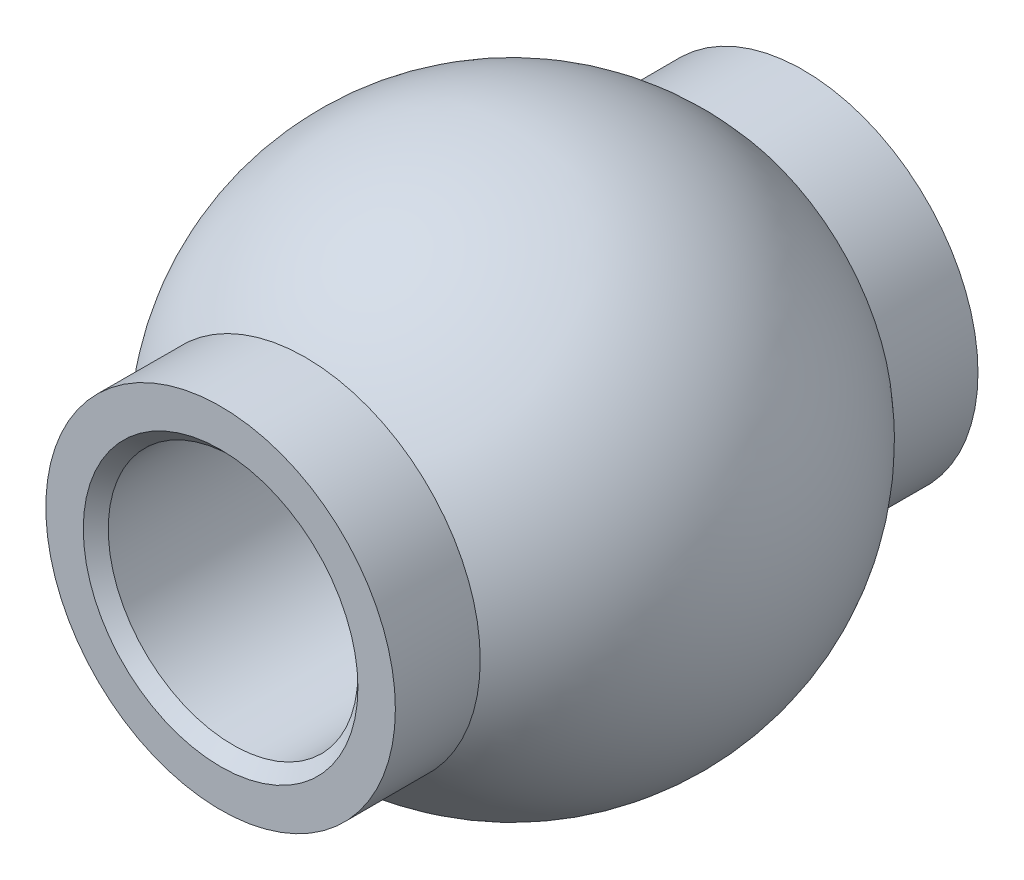
ISO-10303-21;
HEADER;
FILE_DESCRIPTION(('STEP AP214'),'2;1');
FILE_NAME('part.step','',(''),(''),'','','');
FILE_SCHEMA(('AUTOMOTIVE_DESIGN { 1 0 10303 214 1 1 1 1 }'));
ENDSEC;
DATA;
#1=APPLICATION_CONTEXT('core data for automotive mechanical design processes');
#2=APPLICATION_PROTOCOL_DEFINITION('international standard','automotive_design',2000,#1);
#3=PRODUCT_CONTEXT('',#1,'mechanical');
#4=PRODUCT('Part','Part','',(#3));
#5=PRODUCT_RELATED_PRODUCT_CATEGORY('part','',(#4));
#6=PRODUCT_DEFINITION_FORMATION('','',#4);
#7=PRODUCT_DEFINITION_CONTEXT('part definition',#1,'design');
#8=PRODUCT_DEFINITION('design','',#6,#7);
#9=PRODUCT_DEFINITION_SHAPE('','',#8);
#10=(LENGTH_UNIT() NAMED_UNIT(*) SI_UNIT(.MILLI.,.METRE.));
#11=(NAMED_UNIT(*) PLANE_ANGLE_UNIT() SI_UNIT($,.RADIAN.));
#12=(NAMED_UNIT(*) SI_UNIT($,.STERADIAN.) SOLID_ANGLE_UNIT());
#13=UNCERTAINTY_MEASURE_WITH_UNIT(LENGTH_MEASURE(1.E-05),#10,'distance_accuracy_value','');
#14=(GEOMETRIC_REPRESENTATION_CONTEXT(3) GLOBAL_UNCERTAINTY_ASSIGNED_CONTEXT((#13)) GLOBAL_UNIT_ASSIGNED_CONTEXT((#10,
#11,#12)) REPRESENTATION_CONTEXT('',''));
#15=CARTESIAN_POINT('',(0.,0.,0.));
#16=DIRECTION('',(0.,0.,1.));
#17=DIRECTION('',(1.,0.,0.));
#18=AXIS2_PLACEMENT_3D('',#15,#16,#17);
#19=CARTESIAN_POINT('',(0.,19.05,0.));
#20=DIRECTION('',(0.,-1.,0.));
#21=DIRECTION('',(-1.,0.,0.));
#22=AXIS2_PLACEMENT_3D('',#19,#20,#21);
#23=SPHERICAL_SURFACE('',#22,10.31875);
#24=CARTESIAN_POINT('',(0.,19.05,0.));
#25=DIRECTION('',(0.,0.,-1.));
#26=DIRECTION('',(-1.,0.,0.));
#27=AXIS2_PLACEMENT_3D('',#24,#25,#26);
#28=SPHERICAL_SURFACE('',#27,10.31875);
#29=CARTESIAN_POINT('',(0.,19.05,7.87534413930591));
#30=DIRECTION('',(0.,0.,-1.));
#31=DIRECTION('',(-1.,0.,0.));
#32=AXIS2_PLACEMENT_3D('',#29,#30,#31);
#33=CIRCLE('',#32,6.6675);
#34=CARTESIAN_POINT('',(-6.66750000000001,19.05,7.87534413930591));
#35=VERTEX_POINT('',#34);
#36=EDGE_CURVE('E56',#35,#35,#33,.F.);
#37=ORIENTED_EDGE('',*,*,#36,.F.);
#38=EDGE_LOOP('',(#37));
#39=FACE_BOUND('',#38,.T.);
#40=CARTESIAN_POINT('',(0.,19.05,-7.87534413930591));
#41=DIRECTION('',(0.,0.,1.));
#42=DIRECTION('',(1.,0.,0.));
#43=AXIS2_PLACEMENT_3D('',#40,#41,#42);
#44=CIRCLE('',#43,6.6675);
#45=CARTESIAN_POINT('',(6.66749999999999,19.05,-7.87534413930591));
#46=VERTEX_POINT('',#45);
#47=EDGE_CURVE('E59',#46,#46,#44,.F.);
#48=ORIENTED_EDGE('',*,*,#47,.F.);
#49=EDGE_LOOP('',(#48));
#50=FACE_BOUND('',#49,.T.);
#51=ADVANCED_FACE('F36',(#39,#50),#28,.T.);
#52=CARTESIAN_POINT('',(0.,19.05,-11.1125));
#53=DIRECTION('',(0.,0.,1.));
#54=DIRECTION('',(1.,0.,0.));
#55=AXIS2_PLACEMENT_3D('',#52,#53,#54);
#56=CYLINDRICAL_SURFACE('',#55,6.6675);
#57=ORIENTED_EDGE('',*,*,#47,.T.);
#58=EDGE_LOOP('',(#57));
#59=FACE_BOUND('',#58,.T.);
#60=CARTESIAN_POINT('',(0.,19.05,-11.1125));
#61=DIRECTION('',(0.,0.,1.));
#62=DIRECTION('',(1.,0.,0.));
#63=AXIS2_PLACEMENT_3D('',#60,#61,#62);
#64=CIRCLE('',#63,6.6675);
#65=CARTESIAN_POINT('',(6.66749999999999,19.05,-11.1125));
#66=VERTEX_POINT('',#65);
#67=EDGE_CURVE('E62',#66,#66,#64,.T.);
#68=ORIENTED_EDGE('',*,*,#67,.T.);
#69=EDGE_LOOP('',(#68));
#70=FACE_BOUND('',#69,.T.);
#71=ADVANCED_FACE('F76',(#59,#70),#56,.T.);
#72=CARTESIAN_POINT('',(0.,19.05,-11.1125));
#73=DIRECTION('',(0.,0.,1.));
#74=DIRECTION('',(1.,0.,0.));
#75=AXIS2_PLACEMENT_3D('',#72,#73,#74);
#76=PLANE('',#75);
#77=CARTESIAN_POINT('',(0.,19.05,-11.1125));
#78=DIRECTION('',(0.,0.,1.));
#79=DIRECTION('',(1.,0.,0.));
#80=AXIS2_PLACEMENT_3D('',#77,#78,#79);
#81=CIRCLE('',#80,5.23875);
#82=CARTESIAN_POINT('',(-5.23875000000001,19.05,-11.1125));
#83=VERTEX_POINT('',#82);
#84=EDGE_CURVE('E51',#83,#83,#81,.T.);
#85=ORIENTED_EDGE('',*,*,#84,.T.);
#86=EDGE_LOOP('',(#85));
#87=FACE_BOUND('',#86,.T.);
#88=ORIENTED_EDGE('',*,*,#67,.F.);
#89=EDGE_LOOP('',(#88));
#90=FACE_BOUND('',#89,.T.);
#91=ADVANCED_FACE('F73',(#87,#90),#76,.F.);
#92=ORIENTED_EDGE('',*,*,#36,.T.);
#93=EDGE_LOOP('',(#92));
#94=FACE_BOUND('',#93,.T.);
#95=CARTESIAN_POINT('',(0.,19.05,11.1125));
#96=DIRECTION('',(0.,0.,1.));
#97=DIRECTION('',(1.,0.,0.));
#98=AXIS2_PLACEMENT_3D('',#95,#96,#97);
#99=CIRCLE('',#98,6.6675);
#100=CARTESIAN_POINT('',(6.66749999999999,19.05,11.1125));
#101=VERTEX_POINT('',#100);
#102=EDGE_CURVE('E65',#101,#101,#99,.T.);
#103=ORIENTED_EDGE('',*,*,#102,.F.);
#104=EDGE_LOOP('',(#103));
#105=FACE_BOUND('',#104,.T.);
#106=ADVANCED_FACE('F71',(#94,#105),#56,.T.);
#107=CARTESIAN_POINT('',(0.,19.05,11.1125));
#108=DIRECTION('',(0.,0.,1.));
#109=DIRECTION('',(1.,0.,0.));
#110=AXIS2_PLACEMENT_3D('',#107,#108,#109);
#111=PLANE('',#110);
#112=CARTESIAN_POINT('',(0.,19.05,11.1125));
#113=DIRECTION('',(0.,0.,1.));
#114=DIRECTION('',(1.,0.,0.));
#115=AXIS2_PLACEMENT_3D('',#112,#113,#114);
#116=CIRCLE('',#115,5.23875);
#117=CARTESIAN_POINT('',(5.23874999999999,19.05,11.1125));
#118=VERTEX_POINT('',#117);
#119=EDGE_CURVE('E10',#118,#118,#116,.F.);
#120=ORIENTED_EDGE('',*,*,#119,.T.);
#121=EDGE_LOOP('',(#120));
#122=FACE_BOUND('',#121,.T.);
#123=ORIENTED_EDGE('',*,*,#102,.T.);
#124=EDGE_LOOP('',(#123));
#125=FACE_BOUND('',#124,.T.);
#126=ADVANCED_FACE('F69',(#122,#125),#111,.T.);
#127=CARTESIAN_POINT('',(0.,19.05,-10.31875));
#128=DIRECTION('',(0.,0.,1.));
#129=DIRECTION('',(1.,0.,0.));
#130=AXIS2_PLACEMENT_3D('',#127,#128,#129);
#131=CYLINDRICAL_SURFACE('',#130,4.7625);
#132=CARTESIAN_POINT('',(0.,19.05,-10.63625));
#133=DIRECTION('',(0.,0.,1.));
#134=DIRECTION('',(1.,0.,0.));
#135=AXIS2_PLACEMENT_3D('',#132,#133,#134);
#136=CIRCLE('',#135,4.7625);
#137=CARTESIAN_POINT('',(-4.76250000000001,19.05,-10.63625));
#138=VERTEX_POINT('',#137);
#139=EDGE_CURVE('E43',#138,#138,#136,.F.);
#140=ORIENTED_EDGE('',*,*,#139,.T.);
#141=EDGE_LOOP('',(#140));
#142=FACE_BOUND('',#141,.T.);
#143=CARTESIAN_POINT('',(0.,19.05,10.63625));
#144=DIRECTION('',(0.,0.,1.));
#145=DIRECTION('',(1.,0.,0.));
#146=AXIS2_PLACEMENT_3D('',#143,#144,#145);
#147=CIRCLE('',#146,4.7625);
#148=CARTESIAN_POINT('',(4.76249999999999,19.05,10.63625));
#149=VERTEX_POINT('',#148);
#150=EDGE_CURVE('E47',#149,#149,#147,.T.);
#151=ORIENTED_EDGE('',*,*,#150,.T.);
#152=EDGE_LOOP('',(#151));
#153=FACE_BOUND('',#152,.T.);
#154=ADVANCED_FACE('F81',(#142,#153),#131,.F.);
#155=CARTESIAN_POINT('',(0.,19.05,-11.1125));
#156=DIRECTION('',(0.,0.,-1.));
#157=DIRECTION('',(-1.,0.,0.));
#158=AXIS2_PLACEMENT_3D('',#155,#156,#157);
#159=CONICAL_SURFACE('',#158,5.23875,0.785398163397447);
#160=CARTESIAN_POINT('',(-4.76250000000001,19.05,-10.63625));
#161=CARTESIAN_POINT('',(-4.76746093750001,19.05,-10.6412109375));
#162=CARTESIAN_POINT('',(-4.77242187500001,19.05,-10.646171875));
#163=CARTESIAN_POINT('',(-4.78234375000001,19.05,-10.65609375));
#164=CARTESIAN_POINT('',(-4.78730468750001,19.05,-10.6610546875));
#165=CARTESIAN_POINT('',(-4.79722656250001,19.05,-10.6709765625));
#166=CARTESIAN_POINT('',(-4.80218750000001,19.05,-10.6759375));
#167=CARTESIAN_POINT('',(-4.81210937500001,19.05,-10.685859375));
#168=CARTESIAN_POINT('',(-4.81707031250001,19.05,-10.6908203125));
#169=CARTESIAN_POINT('',(-4.82699218750001,19.05,-10.7007421875));
#170=CARTESIAN_POINT('',(-4.83195312500001,19.05,-10.705703125));
#171=CARTESIAN_POINT('',(-4.84187500000001,19.05,-10.715625));
#172=CARTESIAN_POINT('',(-4.84683593750001,19.05,-10.7205859375));
#173=CARTESIAN_POINT('',(-4.85675781250001,19.05,-10.7305078125));
#174=CARTESIAN_POINT('',(-4.86171875000001,19.05,-10.73546875));
#175=CARTESIAN_POINT('',(-4.87164062500001,19.05,-10.745390625));
#176=CARTESIAN_POINT('',(-4.87660156250001,19.05,-10.7503515625));
#177=CARTESIAN_POINT('',(-4.88652343750001,19.05,-10.7602734375));
#178=CARTESIAN_POINT('',(-4.89148437500001,19.05,-10.765234375));
#179=CARTESIAN_POINT('',(-4.90140625000001,19.05,-10.77515625));
#180=CARTESIAN_POINT('',(-4.90636718750001,19.05,-10.7801171875));
#181=CARTESIAN_POINT('',(-4.91628906250001,19.05,-10.7900390625));
#182=CARTESIAN_POINT('',(-4.92125000000001,19.05,-10.795));
#183=CARTESIAN_POINT('',(-4.93117187500001,19.05,-10.804921875));
#184=CARTESIAN_POINT('',(-4.93613281250001,19.05,-10.8098828125));
#185=CARTESIAN_POINT('',(-4.94605468750001,19.05,-10.8198046875));
#186=CARTESIAN_POINT('',(-4.95101562500001,19.05,-10.824765625));
#187=CARTESIAN_POINT('',(-4.96093750000001,19.05,-10.8346875));
#188=CARTESIAN_POINT('',(-4.96589843750001,19.05,-10.8396484375));
#189=CARTESIAN_POINT('',(-4.97582031250001,19.05,-10.8495703125));
#190=CARTESIAN_POINT('',(-4.98078125000001,19.05,-10.85453125));
#191=CARTESIAN_POINT('',(-4.99070312500001,19.05,-10.864453125));
#192=CARTESIAN_POINT('',(-4.99566406250001,19.05,-10.8694140625));
#193=CARTESIAN_POINT('',(-5.00558593750001,19.05,-10.8793359375));
#194=CARTESIAN_POINT('',(-5.01054687500001,19.05,-10.884296875));
#195=CARTESIAN_POINT('',(-5.02046875000001,19.05,-10.89421875));
#196=CARTESIAN_POINT('',(-5.02542968750001,19.05,-10.8991796875));
#197=CARTESIAN_POINT('',(-5.03535156250001,19.05,-10.9091015625));
#198=CARTESIAN_POINT('',(-5.04031250000001,19.05,-10.9140625));
#199=CARTESIAN_POINT('',(-5.05023437500001,19.05,-10.923984375));
#200=CARTESIAN_POINT('',(-5.05519531250001,19.05,-10.9289453125));
#201=CARTESIAN_POINT('',(-5.06511718750001,19.05,-10.9388671875));
#202=CARTESIAN_POINT('',(-5.07007812500001,19.05,-10.943828125));
#203=CARTESIAN_POINT('',(-5.08000000000001,19.05,-10.95375));
#204=CARTESIAN_POINT('',(-5.08496093750001,19.05,-10.9587109375));
#205=CARTESIAN_POINT('',(-5.09488281250001,19.05,-10.9686328125));
#206=CARTESIAN_POINT('',(-5.09984375000001,19.05,-10.97359375));
#207=CARTESIAN_POINT('',(-5.10976562500001,19.05,-10.983515625));
#208=CARTESIAN_POINT('',(-5.11472656250001,19.05,-10.9884765625));
#209=CARTESIAN_POINT('',(-5.12464843750001,19.05,-10.9983984375));
#210=CARTESIAN_POINT('',(-5.12960937500001,19.05,-11.003359375));
#211=CARTESIAN_POINT('',(-5.13953125000001,19.05,-11.01328125));
#212=CARTESIAN_POINT('',(-5.14449218750001,19.05,-11.0182421875));
#213=CARTESIAN_POINT('',(-5.15441406250001,19.05,-11.0281640625));
#214=CARTESIAN_POINT('',(-5.15937500000001,19.05,-11.033125));
#215=CARTESIAN_POINT('',(-5.16929687500001,19.05,-11.043046875));
#216=CARTESIAN_POINT('',(-5.17425781250001,19.05,-11.0480078125));
#217=CARTESIAN_POINT('',(-5.18417968750001,19.05,-11.0579296875));
#218=CARTESIAN_POINT('',(-5.18914062500001,19.05,-11.062890625));
#219=CARTESIAN_POINT('',(-5.19906250000001,19.05,-11.0728125));
#220=CARTESIAN_POINT('',(-5.20402343750001,19.05,-11.0777734375));
#221=CARTESIAN_POINT('',(-5.21394531250001,19.05,-11.0876953125));
#222=CARTESIAN_POINT('',(-5.21890625000001,19.05,-11.09265625));
#223=CARTESIAN_POINT('',(-5.22882812500001,19.05,-11.102578125));
#224=CARTESIAN_POINT('',(-5.23378906250001,19.05,-11.1075390625));
#225=CARTESIAN_POINT('',(-5.23875000000001,19.05,-11.1125));
#226=B_SPLINE_CURVE_WITH_KNOTS('',3,(#160,#161,#162,#163,#164,#165,#166,#167,#168,#169,#170,
#171,#172,#173,#174,#175,#176,#177,#178,#179,#180,#181,#182,#183,#184,#185,#186,#187,#188,#189,
#190,#191,#192,#193,#194,#195,#196,#197,#198,#199,#200,#201,#202,#203,#204,#205,#206,#207,#208,
#209,#210,#211,#212,#213,#214,#215,#216,#217,#218,#219,#220,#221,#222,#223,#224,#225),
.UNSPECIFIED.,.F.,.F.,(4,2,2,2,2,2,2,2,2,2,2,2,2,2,2,2,2,2,2,2,2,2,2,2,2,2,2,2,2,2,2,2,4),(0.,
0.0210474752837557,0.0420949505675121,0.0631424258512684,0.0841899011350241,0.10523737641878,
0.126284851702535,0.147332326986291,0.168379802270047,0.189427277553803,0.210474752837559,
0.231522228121314,0.25256970340507,0.273617178688826,0.294664653972583,0.315712129256338,
0.336759604540093,0.35780707982385,0.378854555107605,0.399902030391362,0.420949505675117,
0.441996980958874,0.463044456242628,0.484091931526384,0.50513940681014,0.526186882093897,
0.547234357377653,0.568281832661407,0.589329307945164,0.610376783228919,0.631424258512676,
0.652471733796431,0.673519209080187),.UNSPECIFIED.);
#227=EDGE_CURVE('BSEAM95',#138,#83,#226,.T.);
#228=ORIENTED_EDGE('',*,*,#139,.F.);
#229=ORIENTED_EDGE('',*,*,#84,.F.);
#230=ORIENTED_EDGE('',*,*,#227,.T.);
#231=ORIENTED_EDGE('',*,*,#227,.F.);
#232=EDGE_LOOP('',(#228,#230,#229,#231));
#233=FACE_BOUND('',#232,.T.);
#234=ADVANCED_FACE('F95',(#233),#159,.F.);
#235=CARTESIAN_POINT('',(0.,19.05,10.63625));
#236=DIRECTION('',(0.,0.,1.));
#237=DIRECTION('',(1.,0.,0.));
#238=AXIS2_PLACEMENT_3D('',#235,#236,#237);
#239=CONICAL_SURFACE('',#238,4.7625,0.78539816339745);
#240=ORIENTED_EDGE('',*,*,#119,.F.);
#241=EDGE_LOOP('',(#240));
#242=FACE_BOUND('',#241,.T.);
#243=ORIENTED_EDGE('',*,*,#150,.F.);
#244=EDGE_LOOP('',(#243));
#245=FACE_BOUND('',#244,.T.);
#246=ADVANCED_FACE('F38',(#242,#245),#239,.F.);
#247=CLOSED_SHELL('',(#51,#71,#91,#106,#126,#154,#234,#246));
#248=MANIFOLD_SOLID_BREP('B2',#247);
#249=ADVANCED_BREP_SHAPE_REPRESENTATION('',(#18,#248),#14);
#250=SHAPE_DEFINITION_REPRESENTATION(#9,#249);
ENDSEC;
END-ISO-10303-21;
